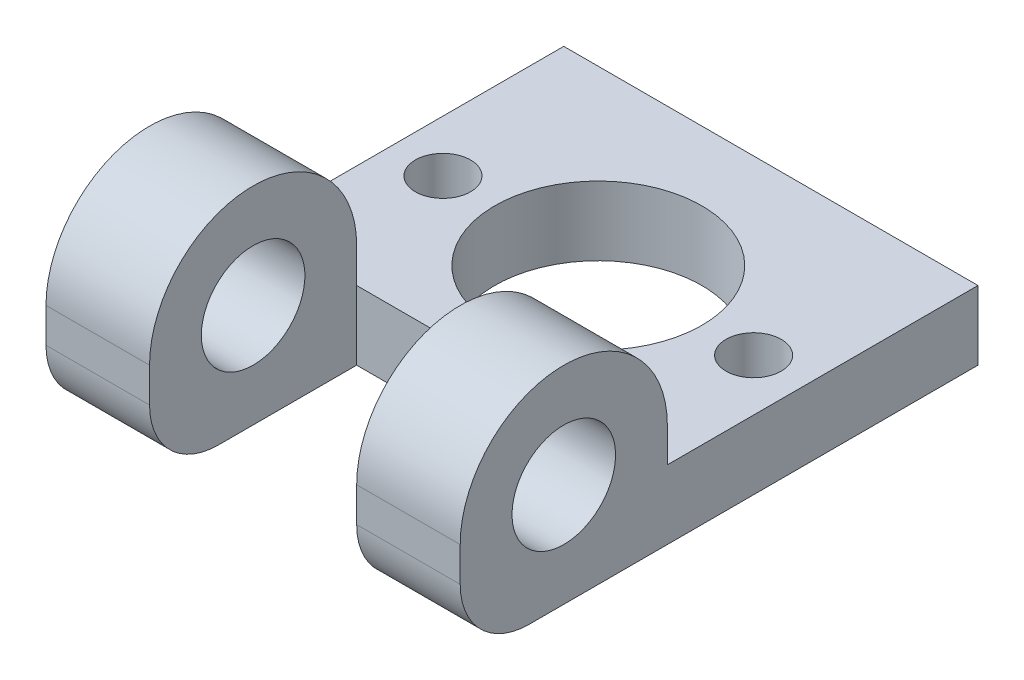
ISO-10303-21;
HEADER;
FILE_DESCRIPTION(('STEP AP214'),'2;1');
FILE_NAME('part.step','',(''),(''),'','','');
FILE_SCHEMA(('AUTOMOTIVE_DESIGN { 1 0 10303 214 1 1 1 1 }'));
ENDSEC;
DATA;
#1=APPLICATION_CONTEXT('core data for automotive mechanical design processes');
#2=APPLICATION_PROTOCOL_DEFINITION('international standard','automotive_design',2000,#1);
#3=PRODUCT_CONTEXT('',#1,'mechanical');
#4=PRODUCT('Part','Part','',(#3));
#5=PRODUCT_RELATED_PRODUCT_CATEGORY('part','',(#4));
#6=PRODUCT_DEFINITION_FORMATION('','',#4);
#7=PRODUCT_DEFINITION_CONTEXT('part definition',#1,'design');
#8=PRODUCT_DEFINITION('design','',#6,#7);
#9=PRODUCT_DEFINITION_SHAPE('','',#8);
#10=(LENGTH_UNIT() NAMED_UNIT(*) SI_UNIT(.MILLI.,.METRE.));
#11=(NAMED_UNIT(*) PLANE_ANGLE_UNIT() SI_UNIT($,.RADIAN.));
#12=(NAMED_UNIT(*) SI_UNIT($,.STERADIAN.) SOLID_ANGLE_UNIT());
#13=UNCERTAINTY_MEASURE_WITH_UNIT(LENGTH_MEASURE(1.E-05),#10,'distance_accuracy_value','');
#14=(GEOMETRIC_REPRESENTATION_CONTEXT(3) GLOBAL_UNCERTAINTY_ASSIGNED_CONTEXT((#13)) GLOBAL_UNIT_ASSIGNED_CONTEXT((#10,
#11,#12)) REPRESENTATION_CONTEXT('',''));
#15=CARTESIAN_POINT('',(0.,0.,0.));
#16=DIRECTION('',(0.,0.,1.));
#17=DIRECTION('',(1.,0.,0.));
#18=AXIS2_PLACEMENT_3D('',#15,#16,#17);
#19=CARTESIAN_POINT('',(6.,2.,7.5));
#20=DIRECTION('',(0.,0.,-1.));
#21=DIRECTION('',(-1.,0.,0.));
#22=AXIS2_PLACEMENT_3D('',#19,#20,#21);
#23=PLANE('',#22);
#24=DIRECTION('',(0.,1.,0.));
#25=VECTOR('',#24,1.);
#26=CARTESIAN_POINT('',(3.,0.,7.5));
#27=LINE('',#26,#25);
#28=CARTESIAN_POINT('',(3.,2.,7.5));
#29=VERTEX_POINT('',#28);
#30=CARTESIAN_POINT('',(3.,3.,7.5));
#31=VERTEX_POINT('',#30);
#32=EDGE_CURVE('E134',#29,#31,#27,.T.);
#33=ORIENTED_EDGE('',*,*,#32,.F.);
#34=DIRECTION('',(1.,0.,0.));
#35=VECTOR('',#34,1.);
#36=CARTESIAN_POINT('',(6.,2.,7.5));
#37=LINE('',#36,#35);
#38=CARTESIAN_POINT('',(6.,2.,7.5));
#39=VERTEX_POINT('',#38);
#40=EDGE_CURVE('E214',#29,#39,#37,.T.);
#41=ORIENTED_EDGE('',*,*,#40,.T.);
#42=DIRECTION('',(0.,-1.,0.));
#43=VECTOR('',#42,1.);
#44=CARTESIAN_POINT('',(6.,2.,7.5));
#45=LINE('',#44,#43);
#46=CARTESIAN_POINT('',(6.,3.,7.5));
#47=VERTEX_POINT('',#46);
#48=EDGE_CURVE('E163',#47,#39,#45,.T.);
#49=ORIENTED_EDGE('',*,*,#48,.F.);
#50=DIRECTION('',(-1.,0.,0.));
#51=VECTOR('',#50,1.);
#52=CARTESIAN_POINT('',(13.211102550928,3.,7.5));
#53=LINE('',#52,#51);
#54=EDGE_CURVE('E154',#47,#31,#53,.T.);
#55=ORIENTED_EDGE('',*,*,#54,.T.);
#56=EDGE_LOOP('',(#33,#41,#49,#55));
#57=FACE_BOUND('',#56,.T.);
#58=ADVANCED_FACE('F41',(#57),#23,.F.);
#59=CARTESIAN_POINT('',(13.211102550928,3.,4.5));
#60=DIRECTION('',(-1.,0.,0.));
#61=DIRECTION('',(0.,0.,1.));
#62=AXIS2_PLACEMENT_3D('',#59,#60,#61);
#63=CYLINDRICAL_SURFACE('',#62,3.);
#64=DIRECTION('',(-1.,0.,0.));
#65=VECTOR('',#64,1.);
#66=CARTESIAN_POINT('',(13.211102550928,3.,1.5));
#67=LINE('',#66,#65);
#68=CARTESIAN_POINT('',(6.,3.,1.5));
#69=VERTEX_POINT('',#68);
#70=CARTESIAN_POINT('',(3.,3.,1.5));
#71=VERTEX_POINT('',#70);
#72=EDGE_CURVE('E160',#69,#71,#67,.T.);
#73=ORIENTED_EDGE('',*,*,#72,.T.);
#74=CARTESIAN_POINT('',(3.,3.,4.5));
#75=DIRECTION('',(-1.,0.,0.));
#76=DIRECTION('',(0.,0.,1.));
#77=AXIS2_PLACEMENT_3D('',#74,#75,#76);
#78=CIRCLE('',#77,3.);
#79=EDGE_CURVE('E142',#31,#71,#78,.T.);
#80=ORIENTED_EDGE('',*,*,#79,.F.);
#81=ORIENTED_EDGE('',*,*,#54,.F.);
#82=CARTESIAN_POINT('',(6.,3.,4.5));
#83=DIRECTION('',(-1.,0.,0.));
#84=DIRECTION('',(0.,0.,1.));
#85=AXIS2_PLACEMENT_3D('',#82,#83,#84);
#86=CIRCLE('',#85,3.);
#87=EDGE_CURVE('E268',#69,#47,#86,.F.);
#88=ORIENTED_EDGE('',*,*,#87,.F.);
#89=EDGE_LOOP('',(#73,#80,#81,#88));
#90=FACE_BOUND('',#89,.T.);
#91=ADVANCED_FACE('F153',(#90),#63,.T.);
#92=CARTESIAN_POINT('',(13.211102550928,0.,1.5));
#93=DIRECTION('',(0.,0.,-1.));
#94=DIRECTION('',(0.,1.,0.));
#95=AXIS2_PLACEMENT_3D('',#92,#93,#94);
#96=PLANE('',#95);
#97=DIRECTION('',(-1.,0.,0.));
#98=VECTOR('',#97,1.);
#99=CARTESIAN_POINT('',(13.211102550928,2.,1.5));
#100=LINE('',#99,#98);
#101=CARTESIAN_POINT('',(6.,2.,1.5));
#102=VERTEX_POINT('',#101);
#103=CARTESIAN_POINT('',(3.,2.,1.5));
#104=VERTEX_POINT('',#103);
#105=EDGE_CURVE('E270',#102,#104,#100,.T.);
#106=ORIENTED_EDGE('',*,*,#105,.T.);
#107=DIRECTION('',(0.,-1.,0.));
#108=VECTOR('',#107,1.);
#109=CARTESIAN_POINT('',(3.,3.,1.5));
#110=LINE('',#109,#108);
#111=EDGE_CURVE('E296',#71,#104,#110,.T.);
#112=ORIENTED_EDGE('',*,*,#111,.F.);
#113=ORIENTED_EDGE('',*,*,#72,.F.);
#114=DIRECTION('',(0.,1.,0.));
#115=VECTOR('',#114,1.);
#116=CARTESIAN_POINT('',(6.,0.,1.5));
#117=LINE('',#116,#115);
#118=EDGE_CURVE('E273',#102,#69,#117,.T.);
#119=ORIENTED_EDGE('',*,*,#118,.F.);
#120=EDGE_LOOP('',(#106,#112,#113,#119));
#121=FACE_BOUND('',#120,.T.);
#122=ADVANCED_FACE('F329',(#121),#96,.T.);
#123=CARTESIAN_POINT('',(13.211102550928,3.,4.5));
#124=DIRECTION('',(-1.,0.,0.));
#125=DIRECTION('',(0.,0.,1.));
#126=AXIS2_PLACEMENT_3D('',#123,#124,#125);
#127=CYLINDRICAL_SURFACE('',#126,1.5);
#128=CARTESIAN_POINT('',(6.,3.,4.5));
#129=DIRECTION('',(-1.,0.,0.));
#130=DIRECTION('',(0.,0.,1.));
#131=AXIS2_PLACEMENT_3D('',#128,#129,#130);
#132=CIRCLE('',#131,1.5);
#133=CARTESIAN_POINT('',(6.,3.,6.));
#134=VERTEX_POINT('',#133);
#135=EDGE_CURVE('E180',#134,#134,#132,.F.);
#136=ORIENTED_EDGE('',*,*,#135,.T.);
#137=EDGE_LOOP('',(#136));
#138=FACE_BOUND('',#137,.T.);
#139=CARTESIAN_POINT('',(3.,3.,4.5));
#140=DIRECTION('',(-1.,0.,0.));
#141=DIRECTION('',(0.,0.,1.));
#142=AXIS2_PLACEMENT_3D('',#139,#140,#141);
#143=CIRCLE('',#142,1.5);
#144=CARTESIAN_POINT('',(3.,3.,6.));
#145=VERTEX_POINT('',#144);
#146=EDGE_CURVE('E211',#145,#145,#143,.F.);
#147=ORIENTED_EDGE('',*,*,#146,.F.);
#148=EDGE_LOOP('',(#147));
#149=FACE_BOUND('',#148,.T.);
#150=ADVANCED_FACE('F311',(#138,#149),#127,.F.);
#151=CARTESIAN_POINT('',(0.,2.,0.));
#152=DIRECTION('',(0.,1.,0.));
#153=DIRECTION('',(0.,0.,1.));
#154=AXIS2_PLACEMENT_3D('',#151,#152,#153);
#155=PLANE('',#154);
#156=ORIENTED_EDGE('',*,*,#105,.F.);
#157=DIRECTION('',(0.,0.,-1.));
#158=VECTOR('',#157,1.);
#159=CARTESIAN_POINT('',(6.,2.,7.5));
#160=LINE('',#159,#158);
#161=CARTESIAN_POINT('',(6.,2.,-7.5));
#162=VERTEX_POINT('',#161);
#163=EDGE_CURVE('E195',#102,#162,#160,.T.);
#164=ORIENTED_EDGE('',*,*,#163,.T.);
#165=DIRECTION('',(-1.,0.,0.));
#166=VECTOR('',#165,1.);
#167=CARTESIAN_POINT('',(6.,2.,-7.5));
#168=LINE('',#167,#166);
#169=CARTESIAN_POINT('',(-6.,2.,-7.5));
#170=VERTEX_POINT('',#169);
#171=EDGE_CURVE('E196',#162,#170,#168,.T.);
#172=ORIENTED_EDGE('',*,*,#171,.T.);
#173=DIRECTION('',(0.,0.,1.));
#174=VECTOR('',#173,1.);
#175=CARTESIAN_POINT('',(-6.,2.,7.5));
#176=LINE('',#175,#174);
#177=CARTESIAN_POINT('',(-6.,2.,1.5));
#178=VERTEX_POINT('',#177);
#179=EDGE_CURVE('E188',#170,#178,#176,.T.);
#180=ORIENTED_EDGE('',*,*,#179,.T.);
#181=CARTESIAN_POINT('',(-3.,2.,1.5));
#182=VERTEX_POINT('',#181);
#183=EDGE_CURVE('E272',#182,#178,#100,.T.);
#184=ORIENTED_EDGE('',*,*,#183,.F.);
#185=EDGE_CURVE('E269',#104,#182,#100,.T.);
#186=ORIENTED_EDGE('',*,*,#185,.F.);
#187=EDGE_LOOP('',(#156,#164,#172,#180,#184,#186));
#188=FACE_BOUND('',#187,.T.);
#189=CARTESIAN_POINT('',(4.5,2.,-2.5));
#190=DIRECTION('',(0.,1.,0.));
#191=DIRECTION('',(0.,0.,1.));
#192=AXIS2_PLACEMENT_3D('',#189,#190,#191);
#193=CIRCLE('',#192,0.800000000000001);
#194=CARTESIAN_POINT('',(4.5,2.,-1.7));
#195=VERTEX_POINT('',#194);
#196=EDGE_CURVE('E178',#195,#195,#193,.T.);
#197=ORIENTED_EDGE('',*,*,#196,.F.);
#198=EDGE_LOOP('',(#197));
#199=FACE_BOUND('',#198,.T.);
#200=CARTESIAN_POINT('',(-4.5,2.,-2.5));
#201=DIRECTION('',(0.,1.,0.));
#202=DIRECTION('',(0.,0.,1.));
#203=AXIS2_PLACEMENT_3D('',#200,#201,#202);
#204=CIRCLE('',#203,0.8);
#205=CARTESIAN_POINT('',(-4.5,2.,-1.7));
#206=VERTEX_POINT('',#205);
#207=EDGE_CURVE('E183',#206,#206,#204,.T.);
#208=ORIENTED_EDGE('',*,*,#207,.F.);
#209=EDGE_LOOP('',(#208));
#210=FACE_BOUND('',#209,.T.);
#211=CARTESIAN_POINT('',(0.,2.,-2.5));
#212=DIRECTION('',(0.,1.,0.));
#213=DIRECTION('',(0.,0.,1.));
#214=AXIS2_PLACEMENT_3D('',#211,#212,#213);
#215=CIRCLE('',#214,3.);
#216=CARTESIAN_POINT('',(0.,2.,0.500000000000003));
#217=VERTEX_POINT('',#216);
#218=EDGE_CURVE('E167',#217,#217,#215,.T.);
#219=ORIENTED_EDGE('',*,*,#218,.F.);
#220=EDGE_LOOP('',(#219));
#221=FACE_BOUND('',#220,.T.);
#222=ADVANCED_FACE('F282',(#188,#199,#210,#221),#155,.T.);
#223=CARTESIAN_POINT('',(0.,0.,0.));
#224=DIRECTION('',(0.,1.,0.));
#225=DIRECTION('',(0.,0.,1.));
#226=AXIS2_PLACEMENT_3D('',#223,#224,#225);
#227=PLANE('',#226);
#228=DIRECTION('',(0.,0.,-1.));
#229=VECTOR('',#228,1.);
#230=CARTESIAN_POINT('',(6.,0.,7.5));
#231=LINE('',#230,#229);
#232=CARTESIAN_POINT('',(6.,0.,5.5));
#233=VERTEX_POINT('',#232);
#234=CARTESIAN_POINT('',(6.,0.,-7.5));
#235=VERTEX_POINT('',#234);
#236=EDGE_CURVE('E199',#233,#235,#231,.T.);
#237=ORIENTED_EDGE('',*,*,#236,.F.);
#238=DIRECTION('',(1.,0.,0.));
#239=VECTOR('',#238,1.);
#240=CARTESIAN_POINT('',(0.,0.,5.5));
#241=LINE('',#240,#239);
#242=CARTESIAN_POINT('',(3.,0.,5.5));
#243=VERTEX_POINT('',#242);
#244=EDGE_CURVE('E224',#233,#243,#241,.F.);
#245=ORIENTED_EDGE('',*,*,#244,.T.);
#246=DIRECTION('',(0.,0.,1.));
#247=VECTOR('',#246,1.);
#248=CARTESIAN_POINT('',(3.,0.,1.5));
#249=LINE('',#248,#247);
#250=CARTESIAN_POINT('',(3.,0.,1.5));
#251=VERTEX_POINT('',#250);
#252=EDGE_CURVE('E300',#251,#243,#249,.T.);
#253=ORIENTED_EDGE('',*,*,#252,.F.);
#254=DIRECTION('',(1.,0.,0.));
#255=VECTOR('',#254,1.);
#256=CARTESIAN_POINT('',(-3.,0.,1.5));
#257=LINE('',#256,#255);
#258=CARTESIAN_POINT('',(-3.,0.,1.5));
#259=VERTEX_POINT('',#258);
#260=EDGE_CURVE('E216',#259,#251,#257,.T.);
#261=ORIENTED_EDGE('',*,*,#260,.F.);
#262=DIRECTION('',(0.,0.,1.));
#263=VECTOR('',#262,1.);
#264=CARTESIAN_POINT('',(-3.,0.,1.5));
#265=LINE('',#264,#263);
#266=CARTESIAN_POINT('',(-3.,0.,5.5));
#267=VERTEX_POINT('',#266);
#268=EDGE_CURVE('E236',#259,#267,#265,.T.);
#269=ORIENTED_EDGE('',*,*,#268,.T.);
#270=DIRECTION('',(1.,0.,0.));
#271=VECTOR('',#270,1.);
#272=CARTESIAN_POINT('',(0.,0.,5.5));
#273=LINE('',#272,#271);
#274=CARTESIAN_POINT('',(-6.,0.,5.5));
#275=VERTEX_POINT('',#274);
#276=EDGE_CURVE('E222',#267,#275,#273,.F.);
#277=ORIENTED_EDGE('',*,*,#276,.T.);
#278=DIRECTION('',(0.,0.,1.));
#279=VECTOR('',#278,1.);
#280=CARTESIAN_POINT('',(-6.,0.,7.5));
#281=LINE('',#280,#279);
#282=CARTESIAN_POINT('',(-6.,0.,-7.5));
#283=VERTEX_POINT('',#282);
#284=EDGE_CURVE('E190',#283,#275,#281,.T.);
#285=ORIENTED_EDGE('',*,*,#284,.F.);
#286=DIRECTION('',(-1.,0.,0.));
#287=VECTOR('',#286,1.);
#288=CARTESIAN_POINT('',(6.,0.,-7.5));
#289=LINE('',#288,#287);
#290=EDGE_CURVE('E193',#235,#283,#289,.T.);
#291=ORIENTED_EDGE('',*,*,#290,.F.);
#292=EDGE_LOOP('',(#237,#245,#253,#261,#269,#277,#285,#291));
#293=FACE_BOUND('',#292,.T.);
#294=CARTESIAN_POINT('',(-4.5,0.,-2.5));
#295=DIRECTION('',(0.,1.,0.));
#296=DIRECTION('',(0.,0.,1.));
#297=AXIS2_PLACEMENT_3D('',#294,#295,#296);
#298=CIRCLE('',#297,0.8);
#299=CARTESIAN_POINT('',(-4.5,0.,-1.7));
#300=VERTEX_POINT('',#299);
#301=EDGE_CURVE('E181',#300,#300,#298,.T.);
#302=ORIENTED_EDGE('',*,*,#301,.T.);
#303=EDGE_LOOP('',(#302));
#304=FACE_BOUND('',#303,.T.);
#305=CARTESIAN_POINT('',(4.5,0.,-2.5));
#306=DIRECTION('',(0.,1.,0.));
#307=DIRECTION('',(0.,0.,1.));
#308=AXIS2_PLACEMENT_3D('',#305,#306,#307);
#309=CIRCLE('',#308,0.800000000000001);
#310=CARTESIAN_POINT('',(4.5,0.,-1.7));
#311=VERTEX_POINT('',#310);
#312=EDGE_CURVE('E173',#311,#311,#309,.T.);
#313=ORIENTED_EDGE('',*,*,#312,.T.);
#314=EDGE_LOOP('',(#313));
#315=FACE_BOUND('',#314,.T.);
#316=CARTESIAN_POINT('',(0.,0.,-2.5));
#317=DIRECTION('',(0.,1.,0.));
#318=DIRECTION('',(0.,0.,1.));
#319=AXIS2_PLACEMENT_3D('',#316,#317,#318);
#320=CIRCLE('',#319,3.);
#321=CARTESIAN_POINT('',(0.,0.,0.500000000000003));
#322=VERTEX_POINT('',#321);
#323=EDGE_CURVE('E172',#322,#322,#320,.T.);
#324=ORIENTED_EDGE('',*,*,#323,.T.);
#325=EDGE_LOOP('',(#324));
#326=FACE_BOUND('',#325,.T.);
#327=ADVANCED_FACE('F245',(#293,#304,#315,#326),#227,.F.);
#328=CARTESIAN_POINT('',(-6.,2.,7.5));
#329=DIRECTION('',(1.,0.,0.));
#330=DIRECTION('',(0.,0.,-1.));
#331=AXIS2_PLACEMENT_3D('',#328,#329,#330);
#332=PLANE('',#331);
#333=CARTESIAN_POINT('',(-6.,3.,4.5));
#334=DIRECTION('',(-1.,0.,0.));
#335=DIRECTION('',(0.,0.,1.));
#336=AXIS2_PLACEMENT_3D('',#333,#334,#335);
#337=CIRCLE('',#336,1.5);
#338=CARTESIAN_POINT('',(-6.,3.,6.));
#339=VERTEX_POINT('',#338);
#340=EDGE_CURVE('E217',#339,#339,#337,.T.);
#341=ORIENTED_EDGE('',*,*,#340,.F.);
#342=EDGE_LOOP('',(#341));
#343=FACE_BOUND('',#342,.T.);
#344=ORIENTED_EDGE('',*,*,#284,.T.);
#345=CARTESIAN_POINT('',(-6.,2.,5.5));
#346=DIRECTION('',(1.,0.,0.));
#347=DIRECTION('',(0.,0.,-1.));
#348=AXIS2_PLACEMENT_3D('',#345,#346,#347);
#349=CIRCLE('',#348,2.);
#350=CARTESIAN_POINT('',(-6.,2.,7.5));
#351=VERTEX_POINT('',#350);
#352=EDGE_CURVE('E11',#275,#351,#349,.F.);
#353=ORIENTED_EDGE('',*,*,#352,.T.);
#354=DIRECTION('',(0.,-1.,0.));
#355=VECTOR('',#354,1.);
#356=CARTESIAN_POINT('',(-6.,2.,7.5));
#357=LINE('',#356,#355);
#358=CARTESIAN_POINT('',(-6.,3.,7.5));
#359=VERTEX_POINT('',#358);
#360=EDGE_CURVE('E209',#359,#351,#357,.T.);
#361=ORIENTED_EDGE('',*,*,#360,.F.);
#362=CARTESIAN_POINT('',(-6.,3.,4.5));
#363=DIRECTION('',(-1.,0.,0.));
#364=DIRECTION('',(0.,0.,1.));
#365=AXIS2_PLACEMENT_3D('',#362,#363,#364);
#366=CIRCLE('',#365,3.);
#367=CARTESIAN_POINT('',(-6.,3.,1.5));
#368=VERTEX_POINT('',#367);
#369=EDGE_CURVE('E259',#359,#368,#366,.T.);
#370=ORIENTED_EDGE('',*,*,#369,.T.);
#371=DIRECTION('',(0.,-1.,0.));
#372=VECTOR('',#371,1.);
#373=CARTESIAN_POINT('',(-6.,0.,1.5));
#374=LINE('',#373,#372);
#375=EDGE_CURVE('E170',#368,#178,#374,.T.);
#376=ORIENTED_EDGE('',*,*,#375,.T.);
#377=ORIENTED_EDGE('',*,*,#179,.F.);
#378=DIRECTION('',(0.,-1.,0.));
#379=VECTOR('',#378,1.);
#380=CARTESIAN_POINT('',(-6.,2.,-7.5));
#381=LINE('',#380,#379);
#382=EDGE_CURVE('E198',#170,#283,#381,.T.);
#383=ORIENTED_EDGE('',*,*,#382,.T.);
#384=EDGE_LOOP('',(#344,#353,#361,#370,#376,#377,#383));
#385=FACE_BOUND('',#384,.T.);
#386=ADVANCED_FACE('F251',(#343,#385),#332,.F.);
#387=ORIENTED_EDGE('',*,*,#360,.T.);
#388=DIRECTION('',(1.,0.,0.));
#389=VECTOR('',#388,1.);
#390=CARTESIAN_POINT('',(6.,2.,7.5));
#391=LINE('',#390,#389);
#392=CARTESIAN_POINT('',(-3.,2.,7.5));
#393=VERTEX_POINT('',#392);
#394=EDGE_CURVE('E226',#351,#393,#391,.T.);
#395=ORIENTED_EDGE('',*,*,#394,.T.);
#396=DIRECTION('',(0.,1.,0.));
#397=VECTOR('',#396,1.);
#398=CARTESIAN_POINT('',(-3.,0.,7.5));
#399=LINE('',#398,#397);
#400=CARTESIAN_POINT('',(-3.,3.,7.5));
#401=VERTEX_POINT('',#400);
#402=EDGE_CURVE('E237',#393,#401,#399,.T.);
#403=ORIENTED_EDGE('',*,*,#402,.T.);
#404=EDGE_CURVE('E165',#401,#359,#53,.T.);
#405=ORIENTED_EDGE('',*,*,#404,.T.);
#406=EDGE_LOOP('',(#387,#395,#403,#405));
#407=FACE_BOUND('',#406,.T.);
#408=ADVANCED_FACE('F249',(#407),#23,.F.);
#409=CARTESIAN_POINT('',(6.,2.,7.5));
#410=DIRECTION('',(-1.,0.,0.));
#411=DIRECTION('',(0.,0.,1.));
#412=AXIS2_PLACEMENT_3D('',#409,#410,#411);
#413=PLANE('',#412);
#414=ORIENTED_EDGE('',*,*,#135,.F.);
#415=EDGE_LOOP('',(#414));
#416=FACE_BOUND('',#415,.T.);
#417=ORIENTED_EDGE('',*,*,#48,.T.);
#418=CARTESIAN_POINT('',(6.,2.,5.5));
#419=DIRECTION('',(-1.,0.,0.));
#420=DIRECTION('',(0.,0.,1.));
#421=AXIS2_PLACEMENT_3D('',#418,#419,#420);
#422=CIRCLE('',#421,2.);
#423=EDGE_CURVE('E221',#39,#233,#422,.F.);
#424=ORIENTED_EDGE('',*,*,#423,.T.);
#425=ORIENTED_EDGE('',*,*,#236,.T.);
#426=DIRECTION('',(0.,-1.,0.));
#427=VECTOR('',#426,1.);
#428=CARTESIAN_POINT('',(6.,2.,-7.5));
#429=LINE('',#428,#427);
#430=EDGE_CURVE('E204',#162,#235,#429,.T.);
#431=ORIENTED_EDGE('',*,*,#430,.F.);
#432=ORIENTED_EDGE('',*,*,#163,.F.);
#433=ORIENTED_EDGE('',*,*,#118,.T.);
#434=ORIENTED_EDGE('',*,*,#87,.T.);
#435=EDGE_LOOP('',(#417,#424,#425,#431,#432,#433,#434));
#436=FACE_BOUND('',#435,.T.);
#437=ADVANCED_FACE('F295',(#416,#436),#413,.F.);
#438=CARTESIAN_POINT('',(6.,2.,-7.5));
#439=DIRECTION('',(0.,0.,1.));
#440=DIRECTION('',(1.,0.,0.));
#441=AXIS2_PLACEMENT_3D('',#438,#439,#440);
#442=PLANE('',#441);
#443=ORIENTED_EDGE('',*,*,#290,.T.);
#444=ORIENTED_EDGE('',*,*,#382,.F.);
#445=ORIENTED_EDGE('',*,*,#171,.F.);
#446=ORIENTED_EDGE('',*,*,#430,.T.);
#447=EDGE_LOOP('',(#443,#444,#445,#446));
#448=FACE_BOUND('',#447,.T.);
#449=ADVANCED_FACE('F293',(#448),#442,.F.);
#450=CARTESIAN_POINT('',(-4.5,2.,-2.5));
#451=DIRECTION('',(0.,-1.,0.));
#452=DIRECTION('',(0.,0.,-1.));
#453=AXIS2_PLACEMENT_3D('',#450,#451,#452);
#454=CYLINDRICAL_SURFACE('',#453,0.8);
#455=ORIENTED_EDGE('',*,*,#207,.T.);
#456=EDGE_LOOP('',(#455));
#457=FACE_BOUND('',#456,.T.);
#458=ORIENTED_EDGE('',*,*,#301,.F.);
#459=EDGE_LOOP('',(#458));
#460=FACE_BOUND('',#459,.T.);
#461=ADVANCED_FACE('F324',(#457,#460),#454,.F.);
#462=CARTESIAN_POINT('',(4.5,2.,-2.5));
#463=DIRECTION('',(0.,-1.,0.));
#464=DIRECTION('',(0.,0.,-1.));
#465=AXIS2_PLACEMENT_3D('',#462,#463,#464);
#466=CYLINDRICAL_SURFACE('',#465,0.800000000000001);
#467=ORIENTED_EDGE('',*,*,#196,.T.);
#468=EDGE_LOOP('',(#467));
#469=FACE_BOUND('',#468,.T.);
#470=ORIENTED_EDGE('',*,*,#312,.F.);
#471=EDGE_LOOP('',(#470));
#472=FACE_BOUND('',#471,.T.);
#473=ADVANCED_FACE('F356',(#469,#472),#466,.F.);
#474=CARTESIAN_POINT('',(0.,2.,-2.5));
#475=DIRECTION('',(0.,-1.,0.));
#476=DIRECTION('',(0.,0.,-1.));
#477=AXIS2_PLACEMENT_3D('',#474,#475,#476);
#478=CYLINDRICAL_SURFACE('',#477,3.);
#479=ORIENTED_EDGE('',*,*,#218,.T.);
#480=EDGE_LOOP('',(#479));
#481=FACE_BOUND('',#480,.T.);
#482=ORIENTED_EDGE('',*,*,#323,.F.);
#483=EDGE_LOOP('',(#482));
#484=FACE_BOUND('',#483,.T.);
#485=ADVANCED_FACE('F352',(#481,#484),#478,.F.);
#486=CARTESIAN_POINT('',(-3.,3.,4.5));
#487=DIRECTION('',(-1.,0.,0.));
#488=DIRECTION('',(0.,0.,1.));
#489=AXIS2_PLACEMENT_3D('',#486,#487,#488);
#490=CIRCLE('',#489,3.);
#491=CARTESIAN_POINT('',(-3.,3.,1.5));
#492=VERTEX_POINT('',#491);
#493=EDGE_CURVE('E297',#401,#492,#490,.T.);
#494=ORIENTED_EDGE('',*,*,#493,.T.);
#495=EDGE_CURVE('E161',#492,#368,#67,.T.);
#496=ORIENTED_EDGE('',*,*,#495,.T.);
#497=ORIENTED_EDGE('',*,*,#369,.F.);
#498=ORIENTED_EDGE('',*,*,#404,.F.);
#499=EDGE_LOOP('',(#494,#496,#497,#498));
#500=FACE_BOUND('',#499,.T.);
#501=ADVANCED_FACE('F258',(#500),#63,.T.);
#502=DIRECTION('',(0.,-1.,0.));
#503=VECTOR('',#502,1.);
#504=CARTESIAN_POINT('',(-3.,3.,1.5));
#505=LINE('',#504,#503);
#506=EDGE_CURVE('E250',#492,#182,#505,.T.);
#507=ORIENTED_EDGE('',*,*,#506,.T.);
#508=ORIENTED_EDGE('',*,*,#183,.T.);
#509=ORIENTED_EDGE('',*,*,#375,.F.);
#510=ORIENTED_EDGE('',*,*,#495,.F.);
#511=EDGE_LOOP('',(#507,#508,#509,#510));
#512=FACE_BOUND('',#511,.T.);
#513=ADVANCED_FACE('F277',(#512),#96,.T.);
#514=CARTESIAN_POINT('',(-3.,3.,4.5));
#515=DIRECTION('',(-1.,0.,0.));
#516=DIRECTION('',(0.,0.,1.));
#517=AXIS2_PLACEMENT_3D('',#514,#515,#516);
#518=CIRCLE('',#517,1.5);
#519=CARTESIAN_POINT('',(-3.,3.,6.));
#520=VERTEX_POINT('',#519);
#521=EDGE_CURVE('E212',#520,#520,#518,.F.);
#522=ORIENTED_EDGE('',*,*,#521,.T.);
#523=EDGE_LOOP('',(#522));
#524=FACE_BOUND('',#523,.T.);
#525=ORIENTED_EDGE('',*,*,#340,.T.);
#526=EDGE_LOOP('',(#525));
#527=FACE_BOUND('',#526,.T.);
#528=ADVANCED_FACE('F349',(#524,#527),#127,.F.);
#529=CARTESIAN_POINT('',(-3.,3.,4.5));
#530=DIRECTION('',(-1.,0.,0.));
#531=DIRECTION('',(0.,0.,1.));
#532=AXIS2_PLACEMENT_3D('',#529,#530,#531);
#533=PLANE('',#532);
#534=ORIENTED_EDGE('',*,*,#402,.F.);
#535=CARTESIAN_POINT('',(-3.,2.,5.5));
#536=DIRECTION('',(-1.,0.,0.));
#537=DIRECTION('',(0.,0.,1.));
#538=AXIS2_PLACEMENT_3D('',#535,#536,#537);
#539=CIRCLE('',#538,2.);
#540=EDGE_CURVE('E47',#393,#267,#539,.F.);
#541=ORIENTED_EDGE('',*,*,#540,.T.);
#542=ORIENTED_EDGE('',*,*,#268,.F.);
#543=EDGE_CURVE('E304',#182,#259,#505,.T.);
#544=ORIENTED_EDGE('',*,*,#543,.F.);
#545=ORIENTED_EDGE('',*,*,#506,.F.);
#546=ORIENTED_EDGE('',*,*,#493,.F.);
#547=EDGE_LOOP('',(#534,#541,#542,#544,#545,#546));
#548=FACE_BOUND('',#547,.T.);
#549=ORIENTED_EDGE('',*,*,#521,.F.);
#550=EDGE_LOOP('',(#549));
#551=FACE_BOUND('',#550,.T.);
#552=ADVANCED_FACE('F231',(#548,#551),#533,.F.);
#553=CARTESIAN_POINT('',(3.,3.,4.5));
#554=DIRECTION('',(-1.,0.,0.));
#555=DIRECTION('',(0.,0.,1.));
#556=AXIS2_PLACEMENT_3D('',#553,#554,#555);
#557=PLANE('',#556);
#558=ORIENTED_EDGE('',*,*,#252,.T.);
#559=CARTESIAN_POINT('',(3.,2.,5.5));
#560=DIRECTION('',(-1.,0.,0.));
#561=DIRECTION('',(0.,0.,1.));
#562=AXIS2_PLACEMENT_3D('',#559,#560,#561);
#563=CIRCLE('',#562,2.);
#564=EDGE_CURVE('E144',#243,#29,#563,.T.);
#565=ORIENTED_EDGE('',*,*,#564,.T.);
#566=ORIENTED_EDGE('',*,*,#32,.T.);
#567=ORIENTED_EDGE('',*,*,#79,.T.);
#568=ORIENTED_EDGE('',*,*,#111,.T.);
#569=EDGE_CURVE('E157',#104,#251,#110,.T.);
#570=ORIENTED_EDGE('',*,*,#569,.T.);
#571=EDGE_LOOP('',(#558,#565,#566,#567,#568,#570));
#572=FACE_BOUND('',#571,.T.);
#573=ORIENTED_EDGE('',*,*,#146,.T.);
#574=EDGE_LOOP('',(#573));
#575=FACE_BOUND('',#574,.T.);
#576=ADVANCED_FACE('F137',(#572,#575),#557,.T.);
#577=CARTESIAN_POINT('',(-3.,2.,1.5));
#578=DIRECTION('',(0.,0.,1.));
#579=DIRECTION('',(0.,-1.,0.));
#580=AXIS2_PLACEMENT_3D('',#577,#578,#579);
#581=PLANE('',#580);
#582=ORIENTED_EDGE('',*,*,#543,.T.);
#583=ORIENTED_EDGE('',*,*,#260,.T.);
#584=ORIENTED_EDGE('',*,*,#569,.F.);
#585=ORIENTED_EDGE('',*,*,#185,.T.);
#586=EDGE_LOOP('',(#582,#583,#584,#585));
#587=FACE_BOUND('',#586,.T.);
#588=ADVANCED_FACE('F337',(#587),#581,.T.);
#589=CARTESIAN_POINT('',(6.,2.,5.5));
#590=DIRECTION('',(1.,0.,0.));
#591=DIRECTION('',(0.,0.,-1.));
#592=AXIS2_PLACEMENT_3D('',#589,#590,#591);
#593=CYLINDRICAL_SURFACE('',#592,2.);
#594=ORIENTED_EDGE('',*,*,#564,.F.);
#595=ORIENTED_EDGE('',*,*,#244,.F.);
#596=ORIENTED_EDGE('',*,*,#423,.F.);
#597=ORIENTED_EDGE('',*,*,#40,.F.);
#598=EDGE_LOOP('',(#594,#595,#596,#597));
#599=FACE_BOUND('',#598,.T.);
#600=ADVANCED_FACE('F298',(#599),#593,.T.);
#601=CARTESIAN_POINT('',(6.,2.,5.5));
#602=DIRECTION('',(1.,0.,0.));
#603=DIRECTION('',(0.,0.,-1.));
#604=AXIS2_PLACEMENT_3D('',#601,#602,#603);
#605=CYLINDRICAL_SURFACE('',#604,2.);
#606=ORIENTED_EDGE('',*,*,#352,.F.);
#607=ORIENTED_EDGE('',*,*,#276,.F.);
#608=ORIENTED_EDGE('',*,*,#540,.F.);
#609=ORIENTED_EDGE('',*,*,#394,.F.);
#610=EDGE_LOOP('',(#606,#607,#608,#609));
#611=FACE_BOUND('',#610,.T.);
#612=ADVANCED_FACE('F43',(#611),#605,.T.);
#613=CLOSED_SHELL('',(#58,#91,#122,#150,#222,#327,#386,#408,#437,#449,#461,#473,#485,#501,#513,
#528,#552,#576,#588,#600,#612));
#614=MANIFOLD_SOLID_BREP('B2',#613);
#615=ADVANCED_BREP_SHAPE_REPRESENTATION('',(#18,#614),#14);
#616=SHAPE_DEFINITION_REPRESENTATION(#9,#615);
ENDSEC;
END-ISO-10303-21;
